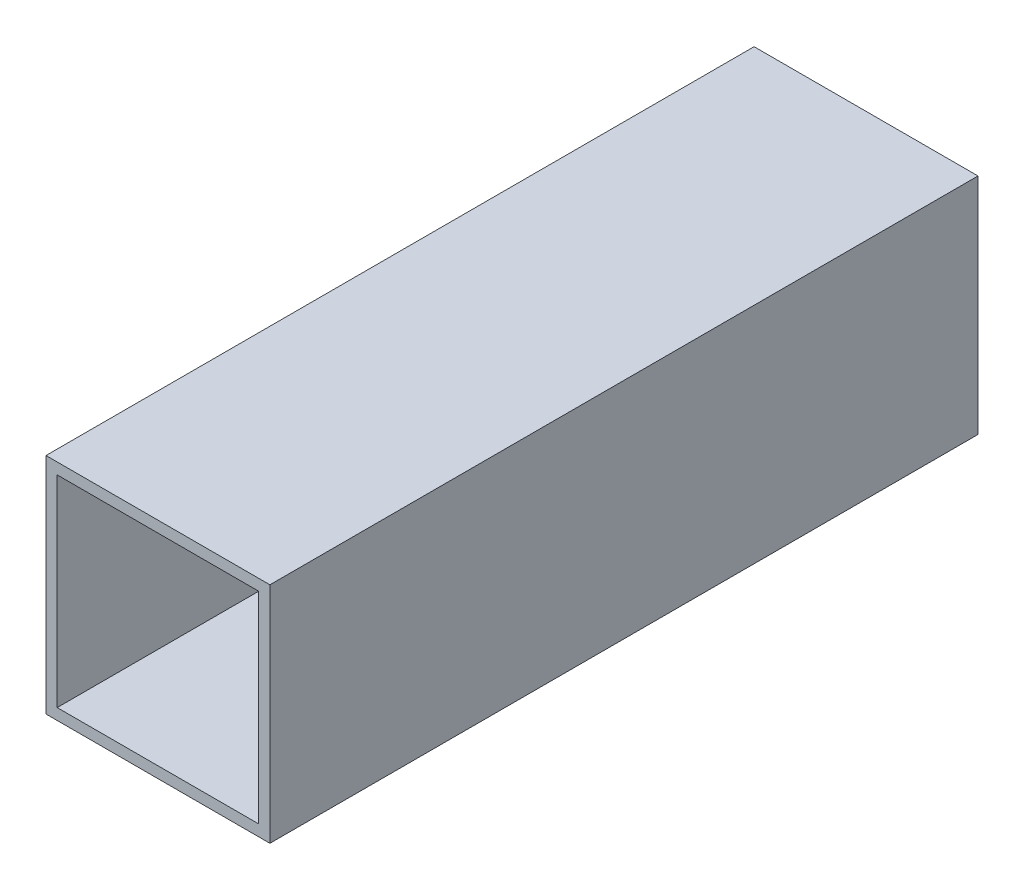
ISO-10303-21;
HEADER;
FILE_DESCRIPTION(('STEP AP214'),'2;1');
FILE_NAME('part.step','',(''),(''),'','','');
FILE_SCHEMA(('AUTOMOTIVE_DESIGN { 1 0 10303 214 1 1 1 1 }'));
ENDSEC;
DATA;
#1=APPLICATION_CONTEXT('core data for automotive mechanical design processes');
#2=APPLICATION_PROTOCOL_DEFINITION('international standard','automotive_design',2000,#1);
#3=PRODUCT_CONTEXT('',#1,'mechanical');
#4=PRODUCT('Part','Part','',(#3));
#5=PRODUCT_RELATED_PRODUCT_CATEGORY('part','',(#4));
#6=PRODUCT_DEFINITION_FORMATION('','',#4);
#7=PRODUCT_DEFINITION_CONTEXT('part definition',#1,'design');
#8=PRODUCT_DEFINITION('design','',#6,#7);
#9=PRODUCT_DEFINITION_SHAPE('','',#8);
#10=(LENGTH_UNIT() NAMED_UNIT(*) SI_UNIT(.MILLI.,.METRE.));
#11=(NAMED_UNIT(*) PLANE_ANGLE_UNIT() SI_UNIT($,.RADIAN.));
#12=(NAMED_UNIT(*) SI_UNIT($,.STERADIAN.) SOLID_ANGLE_UNIT());
#13=UNCERTAINTY_MEASURE_WITH_UNIT(LENGTH_MEASURE(1.E-05),#10,'distance_accuracy_value','');
#14=(GEOMETRIC_REPRESENTATION_CONTEXT(3) GLOBAL_UNCERTAINTY_ASSIGNED_CONTEXT((#13)) GLOBAL_UNIT_ASSIGNED_CONTEXT((#10,
#11,#12)) REPRESENTATION_CONTEXT('',''));
#15=CARTESIAN_POINT('',(0.,0.,0.));
#16=DIRECTION('',(0.,0.,1.));
#17=DIRECTION('',(1.,0.,0.));
#18=AXIS2_PLACEMENT_3D('',#15,#16,#17);
#19=CARTESIAN_POINT('',(-20.,-20.,-1226.5));
#20=DIRECTION('',(0.,0.,-1.));
#21=DIRECTION('',(1.,0.,0.));
#22=AXIS2_PLACEMENT_3D('',#19,#20,#21);
#23=PLANE('',#22);
#24=DIRECTION('',(0.,-1.,0.));
#25=VECTOR('',#24,1.);
#26=CARTESIAN_POINT('',(-20.,-20.,-1226.5));
#27=LINE('',#26,#25);
#28=CARTESIAN_POINT('',(-20.,20.,-1226.5));
#29=VERTEX_POINT('',#28);
#30=CARTESIAN_POINT('',(-20.,-20.,-1226.5));
#31=VERTEX_POINT('',#30);
#32=EDGE_CURVE('E129',#29,#31,#27,.T.);
#33=ORIENTED_EDGE('',*,*,#32,.F.);
#34=DIRECTION('',(-1.,0.,0.));
#35=VECTOR('',#34,1.);
#36=CARTESIAN_POINT('',(20.,20.,-1226.5));
#37=LINE('',#36,#35);
#38=CARTESIAN_POINT('',(20.,20.,-1226.5));
#39=VERTEX_POINT('',#38);
#40=EDGE_CURVE('E139',#39,#29,#37,.T.);
#41=ORIENTED_EDGE('',*,*,#40,.F.);
#42=DIRECTION('',(0.,1.,0.));
#43=VECTOR('',#42,1.);
#44=CARTESIAN_POINT('',(20.,-20.,-1226.5));
#45=LINE('',#44,#43);
#46=CARTESIAN_POINT('',(20.,-20.,-1226.5));
#47=VERTEX_POINT('',#46);
#48=EDGE_CURVE('E136',#47,#39,#45,.T.);
#49=ORIENTED_EDGE('',*,*,#48,.F.);
#50=DIRECTION('',(1.,0.,0.));
#51=VECTOR('',#50,1.);
#52=CARTESIAN_POINT('',(20.,-20.,-1226.5));
#53=LINE('',#52,#51);
#54=EDGE_CURVE('E132',#31,#47,#53,.T.);
#55=ORIENTED_EDGE('',*,*,#54,.F.);
#56=EDGE_LOOP('',(#33,#41,#49,#55));
#57=FACE_BOUND('',#56,.T.);
#58=DIRECTION('',(1.,0.,0.));
#59=VECTOR('',#58,1.);
#60=CARTESIAN_POINT('',(20.,-18.,-1226.5));
#61=LINE('',#60,#59);
#62=CARTESIAN_POINT('',(-18.,-18.,-1226.5));
#63=VERTEX_POINT('',#62);
#64=CARTESIAN_POINT('',(18.,-18.,-1226.5));
#65=VERTEX_POINT('',#64);
#66=EDGE_CURVE('E110',#63,#65,#61,.T.);
#67=ORIENTED_EDGE('',*,*,#66,.T.);
#68=DIRECTION('',(0.,1.,0.));
#69=VECTOR('',#68,1.);
#70=CARTESIAN_POINT('',(18.,-20.,-1226.5));
#71=LINE('',#70,#69);
#72=CARTESIAN_POINT('',(18.,18.,-1226.5));
#73=VERTEX_POINT('',#72);
#74=EDGE_CURVE('E115',#65,#73,#71,.T.);
#75=ORIENTED_EDGE('',*,*,#74,.T.);
#76=DIRECTION('',(-1.,0.,0.));
#77=VECTOR('',#76,1.);
#78=CARTESIAN_POINT('',(20.,18.,-1226.5));
#79=LINE('',#78,#77);
#80=CARTESIAN_POINT('',(-18.,18.,-1226.5));
#81=VERTEX_POINT('',#80);
#82=EDGE_CURVE('E111',#73,#81,#79,.T.);
#83=ORIENTED_EDGE('',*,*,#82,.T.);
#84=DIRECTION('',(0.,-1.,0.));
#85=VECTOR('',#84,1.);
#86=CARTESIAN_POINT('',(-18.,-20.,-1226.5));
#87=LINE('',#86,#85);
#88=EDGE_CURVE('E96',#81,#63,#87,.T.);
#89=ORIENTED_EDGE('',*,*,#88,.T.);
#90=EDGE_LOOP('',(#67,#75,#83,#89));
#91=FACE_BOUND('',#90,.T.);
#92=ADVANCED_FACE('F30',(#57,#91),#23,.T.);
#93=CARTESIAN_POINT('',(-20.,-20.,-1100.));
#94=DIRECTION('',(0.,0.,-1.));
#95=DIRECTION('',(1.,0.,0.));
#96=AXIS2_PLACEMENT_3D('',#93,#94,#95);
#97=PLANE('',#96);
#98=DIRECTION('',(0.,-1.,0.));
#99=VECTOR('',#98,1.);
#100=CARTESIAN_POINT('',(-20.,-20.,-1100.));
#101=LINE('',#100,#99);
#102=CARTESIAN_POINT('',(-20.,20.,-1100.));
#103=VERTEX_POINT('',#102);
#104=CARTESIAN_POINT('',(-20.,-20.,-1100.));
#105=VERTEX_POINT('',#104);
#106=EDGE_CURVE('E104',#103,#105,#101,.T.);
#107=ORIENTED_EDGE('',*,*,#106,.T.);
#108=DIRECTION('',(1.,0.,0.));
#109=VECTOR('',#108,1.);
#110=CARTESIAN_POINT('',(20.,-20.,-1100.));
#111=LINE('',#110,#109);
#112=CARTESIAN_POINT('',(20.,-20.,-1100.));
#113=VERTEX_POINT('',#112);
#114=EDGE_CURVE('E145',#105,#113,#111,.T.);
#115=ORIENTED_EDGE('',*,*,#114,.T.);
#116=DIRECTION('',(0.,1.,0.));
#117=VECTOR('',#116,1.);
#118=CARTESIAN_POINT('',(20.,-20.,-1100.));
#119=LINE('',#118,#117);
#120=CARTESIAN_POINT('',(20.,20.,-1100.));
#121=VERTEX_POINT('',#120);
#122=EDGE_CURVE('E148',#113,#121,#119,.T.);
#123=ORIENTED_EDGE('',*,*,#122,.T.);
#124=DIRECTION('',(-1.,0.,0.));
#125=VECTOR('',#124,1.);
#126=CARTESIAN_POINT('',(20.,20.,-1100.));
#127=LINE('',#126,#125);
#128=EDGE_CURVE('E133',#121,#103,#127,.T.);
#129=ORIENTED_EDGE('',*,*,#128,.T.);
#130=EDGE_LOOP('',(#107,#115,#123,#129));
#131=FACE_BOUND('',#130,.T.);
#132=DIRECTION('',(0.,-1.,0.));
#133=VECTOR('',#132,1.);
#134=CARTESIAN_POINT('',(-18.,-20.,-1100.));
#135=LINE('',#134,#133);
#136=CARTESIAN_POINT('',(-18.,18.,-1100.));
#137=VERTEX_POINT('',#136);
#138=CARTESIAN_POINT('',(-18.,-18.,-1100.));
#139=VERTEX_POINT('',#138);
#140=EDGE_CURVE('E99',#137,#139,#135,.T.);
#141=ORIENTED_EDGE('',*,*,#140,.F.);
#142=DIRECTION('',(-1.,0.,0.));
#143=VECTOR('',#142,1.);
#144=CARTESIAN_POINT('',(20.,18.,-1100.));
#145=LINE('',#144,#143);
#146=CARTESIAN_POINT('',(18.,18.,-1100.));
#147=VERTEX_POINT('',#146);
#148=EDGE_CURVE('E112',#147,#137,#145,.T.);
#149=ORIENTED_EDGE('',*,*,#148,.F.);
#150=DIRECTION('',(0.,1.,0.));
#151=VECTOR('',#150,1.);
#152=CARTESIAN_POINT('',(18.,-20.,-1100.));
#153=LINE('',#152,#151);
#154=CARTESIAN_POINT('',(18.,-18.,-1100.));
#155=VERTEX_POINT('',#154);
#156=EDGE_CURVE('E123',#155,#147,#153,.T.);
#157=ORIENTED_EDGE('',*,*,#156,.F.);
#158=DIRECTION('',(1.,0.,0.));
#159=VECTOR('',#158,1.);
#160=CARTESIAN_POINT('',(20.,-18.,-1100.));
#161=LINE('',#160,#159);
#162=EDGE_CURVE('E121',#139,#155,#161,.T.);
#163=ORIENTED_EDGE('',*,*,#162,.F.);
#164=EDGE_LOOP('',(#141,#149,#157,#163));
#165=FACE_BOUND('',#164,.T.);
#166=ADVANCED_FACE('F165',(#131,#165),#97,.F.);
#167=CARTESIAN_POINT('',(-20.,-20.,-1226.5));
#168=DIRECTION('',(1.,0.,0.));
#169=DIRECTION('',(0.,0.,1.));
#170=AXIS2_PLACEMENT_3D('',#167,#168,#169);
#171=PLANE('',#170);
#172=ORIENTED_EDGE('',*,*,#106,.F.);
#173=DIRECTION('',(0.,0.,1.));
#174=VECTOR('',#173,1.);
#175=CARTESIAN_POINT('',(-20.,20.,-1226.5));
#176=LINE('',#175,#174);
#177=EDGE_CURVE('E142',#29,#103,#176,.T.);
#178=ORIENTED_EDGE('',*,*,#177,.F.);
#179=ORIENTED_EDGE('',*,*,#32,.T.);
#180=DIRECTION('',(0.,0.,1.));
#181=VECTOR('',#180,1.);
#182=CARTESIAN_POINT('',(-20.,-20.,-1226.5));
#183=LINE('',#182,#181);
#184=EDGE_CURVE('E11',#31,#105,#183,.T.);
#185=ORIENTED_EDGE('',*,*,#184,.T.);
#186=EDGE_LOOP('',(#172,#178,#179,#185));
#187=FACE_BOUND('',#186,.T.);
#188=ADVANCED_FACE('F32',(#187),#171,.F.);
#189=CARTESIAN_POINT('',(20.,-20.,-1226.5));
#190=DIRECTION('',(0.,1.,0.));
#191=DIRECTION('',(-1.,0.,0.));
#192=AXIS2_PLACEMENT_3D('',#189,#190,#191);
#193=PLANE('',#192);
#194=ORIENTED_EDGE('',*,*,#114,.F.);
#195=ORIENTED_EDGE('',*,*,#184,.F.);
#196=ORIENTED_EDGE('',*,*,#54,.T.);
#197=DIRECTION('',(0.,0.,1.));
#198=VECTOR('',#197,1.);
#199=CARTESIAN_POINT('',(20.,-20.,-1226.5));
#200=LINE('',#199,#198);
#201=EDGE_CURVE('E38',#47,#113,#200,.T.);
#202=ORIENTED_EDGE('',*,*,#201,.T.);
#203=EDGE_LOOP('',(#194,#195,#196,#202));
#204=FACE_BOUND('',#203,.T.);
#205=ADVANCED_FACE('F158',(#204),#193,.F.);
#206=CARTESIAN_POINT('',(20.,-20.,-1226.5));
#207=DIRECTION('',(-1.,0.,0.));
#208=DIRECTION('',(0.,0.,-1.));
#209=AXIS2_PLACEMENT_3D('',#206,#207,#208);
#210=PLANE('',#209);
#211=ORIENTED_EDGE('',*,*,#122,.F.);
#212=ORIENTED_EDGE('',*,*,#201,.F.);
#213=ORIENTED_EDGE('',*,*,#48,.T.);
#214=DIRECTION('',(0.,0.,1.));
#215=VECTOR('',#214,1.);
#216=CARTESIAN_POINT('',(20.,20.,-1226.5));
#217=LINE('',#216,#215);
#218=EDGE_CURVE('E154',#39,#121,#217,.T.);
#219=ORIENTED_EDGE('',*,*,#218,.T.);
#220=EDGE_LOOP('',(#211,#212,#213,#219));
#221=FACE_BOUND('',#220,.T.);
#222=ADVANCED_FACE('F162',(#221),#210,.F.);
#223=CARTESIAN_POINT('',(20.,20.,-1226.5));
#224=DIRECTION('',(0.,-1.,0.));
#225=DIRECTION('',(1.,0.,0.));
#226=AXIS2_PLACEMENT_3D('',#223,#224,#225);
#227=PLANE('',#226);
#228=ORIENTED_EDGE('',*,*,#128,.F.);
#229=ORIENTED_EDGE('',*,*,#218,.F.);
#230=ORIENTED_EDGE('',*,*,#40,.T.);
#231=ORIENTED_EDGE('',*,*,#177,.T.);
#232=EDGE_LOOP('',(#228,#229,#230,#231));
#233=FACE_BOUND('',#232,.T.);
#234=ADVANCED_FACE('F173',(#233),#227,.F.);
#235=CARTESIAN_POINT('',(-18.,-20.,-1226.5));
#236=DIRECTION('',(1.,0.,0.));
#237=DIRECTION('',(0.,0.,1.));
#238=AXIS2_PLACEMENT_3D('',#235,#236,#237);
#239=PLANE('',#238);
#240=ORIENTED_EDGE('',*,*,#140,.T.);
#241=DIRECTION('',(0.,0.,1.));
#242=VECTOR('',#241,1.);
#243=CARTESIAN_POINT('',(-18.,-18.,-1226.5));
#244=LINE('',#243,#242);
#245=EDGE_CURVE('E93',#63,#139,#244,.T.);
#246=ORIENTED_EDGE('',*,*,#245,.F.);
#247=ORIENTED_EDGE('',*,*,#88,.F.);
#248=DIRECTION('',(0.,0.,1.));
#249=VECTOR('',#248,1.);
#250=CARTESIAN_POINT('',(-18.,18.,-1226.5));
#251=LINE('',#250,#249);
#252=EDGE_CURVE('E53',#81,#137,#251,.T.);
#253=ORIENTED_EDGE('',*,*,#252,.T.);
#254=EDGE_LOOP('',(#240,#246,#247,#253));
#255=FACE_BOUND('',#254,.T.);
#256=ADVANCED_FACE('F95',(#255),#239,.T.);
#257=CARTESIAN_POINT('',(20.,-18.,-1226.5));
#258=DIRECTION('',(0.,1.,0.));
#259=DIRECTION('',(-1.,0.,0.));
#260=AXIS2_PLACEMENT_3D('',#257,#258,#259);
#261=PLANE('',#260);
#262=ORIENTED_EDGE('',*,*,#162,.T.);
#263=DIRECTION('',(0.,0.,1.));
#264=VECTOR('',#263,1.);
#265=CARTESIAN_POINT('',(18.,-18.,-1226.5));
#266=LINE('',#265,#264);
#267=EDGE_CURVE('E105',#65,#155,#266,.T.);
#268=ORIENTED_EDGE('',*,*,#267,.F.);
#269=ORIENTED_EDGE('',*,*,#66,.F.);
#270=ORIENTED_EDGE('',*,*,#245,.T.);
#271=EDGE_LOOP('',(#262,#268,#269,#270));
#272=FACE_BOUND('',#271,.T.);
#273=ADVANCED_FACE('F114',(#272),#261,.T.);
#274=CARTESIAN_POINT('',(18.,-20.,-1226.5));
#275=DIRECTION('',(-1.,0.,0.));
#276=DIRECTION('',(0.,0.,-1.));
#277=AXIS2_PLACEMENT_3D('',#274,#275,#276);
#278=PLANE('',#277);
#279=ORIENTED_EDGE('',*,*,#156,.T.);
#280=DIRECTION('',(0.,0.,1.));
#281=VECTOR('',#280,1.);
#282=CARTESIAN_POINT('',(18.,18.,-1226.5));
#283=LINE('',#282,#281);
#284=EDGE_CURVE('E45',#73,#147,#283,.T.);
#285=ORIENTED_EDGE('',*,*,#284,.F.);
#286=ORIENTED_EDGE('',*,*,#74,.F.);
#287=ORIENTED_EDGE('',*,*,#267,.T.);
#288=EDGE_LOOP('',(#279,#285,#286,#287));
#289=FACE_BOUND('',#288,.T.);
#290=ADVANCED_FACE('F191',(#289),#278,.T.);
#291=CARTESIAN_POINT('',(20.,18.,-1226.5));
#292=DIRECTION('',(0.,-1.,0.));
#293=DIRECTION('',(1.,0.,0.));
#294=AXIS2_PLACEMENT_3D('',#291,#292,#293);
#295=PLANE('',#294);
#296=ORIENTED_EDGE('',*,*,#148,.T.);
#297=ORIENTED_EDGE('',*,*,#252,.F.);
#298=ORIENTED_EDGE('',*,*,#82,.F.);
#299=ORIENTED_EDGE('',*,*,#284,.T.);
#300=EDGE_LOOP('',(#296,#297,#298,#299));
#301=FACE_BOUND('',#300,.T.);
#302=ADVANCED_FACE('F194',(#301),#295,.T.);
#303=CLOSED_SHELL('',(#92,#166,#188,#205,#222,#234,#256,#273,#290,#302));
#304=MANIFOLD_SOLID_BREP('B2',#303);
#305=ADVANCED_BREP_SHAPE_REPRESENTATION('',(#18,#304),#14);
#306=SHAPE_DEFINITION_REPRESENTATION(#9,#305);
ENDSEC;
END-ISO-10303-21;
